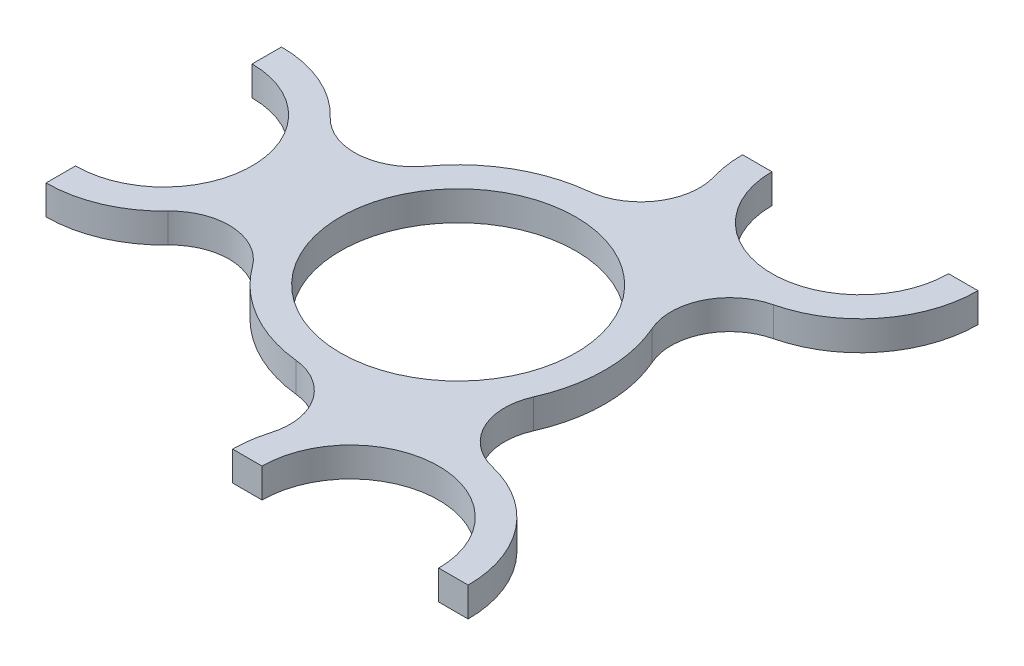
ISO-10303-21;
HEADER;
FILE_DESCRIPTION(('STEP AP214'),'2;1');
FILE_NAME('part.step','',(''),(''),'','','');
FILE_SCHEMA(('AUTOMOTIVE_DESIGN { 1 0 10303 214 1 1 1 1 }'));
ENDSEC;
DATA;
#1=APPLICATION_CONTEXT('core data for automotive mechanical design processes');
#2=APPLICATION_PROTOCOL_DEFINITION('international standard','automotive_design',2000,#1);
#3=PRODUCT_CONTEXT('',#1,'mechanical');
#4=PRODUCT('Part','Part','',(#3));
#5=PRODUCT_RELATED_PRODUCT_CATEGORY('part','',(#4));
#6=PRODUCT_DEFINITION_FORMATION('','',#4);
#7=PRODUCT_DEFINITION_CONTEXT('part definition',#1,'design');
#8=PRODUCT_DEFINITION('design','',#6,#7);
#9=PRODUCT_DEFINITION_SHAPE('','',#8);
#10=(LENGTH_UNIT() NAMED_UNIT(*) SI_UNIT(.MILLI.,.METRE.));
#11=(NAMED_UNIT(*) PLANE_ANGLE_UNIT() SI_UNIT($,.RADIAN.));
#12=(NAMED_UNIT(*) SI_UNIT($,.STERADIAN.) SOLID_ANGLE_UNIT());
#13=UNCERTAINTY_MEASURE_WITH_UNIT(LENGTH_MEASURE(1.E-05),#10,'distance_accuracy_value','');
#14=(GEOMETRIC_REPRESENTATION_CONTEXT(3) GLOBAL_UNCERTAINTY_ASSIGNED_CONTEXT((#13)) GLOBAL_UNIT_ASSIGNED_CONTEXT((#10,
#11,#12)) REPRESENTATION_CONTEXT('',''));
#15=CARTESIAN_POINT('',(0.,0.,0.));
#16=DIRECTION('',(0.,0.,1.));
#17=DIRECTION('',(1.,0.,0.));
#18=AXIS2_PLACEMENT_3D('',#15,#16,#17);
#19=CARTESIAN_POINT('',(50.,10.,86.6));
#20=DIRECTION('',(0.,-1.,0.));
#21=DIRECTION('',(0.,0.,-1.));
#22=AXIS2_PLACEMENT_3D('',#19,#20,#21);
#23=PLANE('',#22);
#24=CARTESIAN_POINT('',(50.,10.,86.6));
#25=DIRECTION('',(0.,-1.,0.));
#26=DIRECTION('',(0.,0.,-1.));
#27=AXIS2_PLACEMENT_3D('',#24,#25,#26);
#28=CIRCLE('',#27,30.);
#29=CARTESIAN_POINT('',(20.,10.,86.6));
#30=VERTEX_POINT('',#29);
#31=CARTESIAN_POINT('',(80.,10.,86.6));
#32=VERTEX_POINT('',#31);
#33=EDGE_CURVE('E277',#30,#32,#28,.T.);
#34=ORIENTED_EDGE('',*,*,#33,.T.);
#35=DIRECTION('',(1.,0.,0.));
#36=VECTOR('',#35,1.);
#37=CARTESIAN_POINT('',(80.,10.,86.6));
#38=LINE('',#37,#36);
#39=CARTESIAN_POINT('',(90.,10.,86.6));
#40=VERTEX_POINT('',#39);
#41=EDGE_CURVE('E145',#32,#40,#38,.T.);
#42=ORIENTED_EDGE('',*,*,#41,.T.);
#43=CARTESIAN_POINT('',(50.,10.,86.6));
#44=DIRECTION('',(0.,1.,0.));
#45=DIRECTION('',(0.,0.,-1.));
#46=AXIS2_PLACEMENT_3D('',#43,#44,#45);
#47=CIRCLE('',#46,40.);
#48=CARTESIAN_POINT('',(59.3596363447783,10.,47.7104486077108));
#49=VERTEX_POINT('',#48);
#50=EDGE_CURVE('E340',#40,#49,#47,.T.);
#51=ORIENTED_EDGE('',*,*,#50,.T.);
#52=CARTESIAN_POINT('',(64.0394545171674,10.,28.2656729115661));
#53=DIRECTION('',(0.,-1.,0.));
#54=DIRECTION('',(0.,0.,1.));
#55=AXIS2_PLACEMENT_3D('',#52,#53,#54);
#56=CIRCLE('',#55,20.);
#57=CARTESIAN_POINT('',(45.7424675122625,10.,20.1897663654044));
#58=VERTEX_POINT('',#57);
#59=EDGE_CURVE('E359',#49,#58,#56,.T.);
#60=ORIENTED_EDGE('',*,*,#59,.T.);
#61=CARTESIAN_POINT('',(0.,10.,0.));
#62=DIRECTION('',(0.,1.,0.));
#63=DIRECTION('',(0.,0.,1.));
#64=AXIS2_PLACEMENT_3D('',#61,#62,#63);
#65=CIRCLE('',#64,50.);
#66=CARTESIAN_POINT('',(45.7424675122625,10.,-20.1897663654044));
#67=VERTEX_POINT('',#66);
#68=EDGE_CURVE('E356',#58,#67,#65,.T.);
#69=ORIENTED_EDGE('',*,*,#68,.T.);
#70=CARTESIAN_POINT('',(64.0394545171674,10.,-28.2656729115661));
#71=DIRECTION('',(0.,-1.,0.));
#72=DIRECTION('',(0.,0.,-1.));
#73=AXIS2_PLACEMENT_3D('',#70,#71,#72);
#74=CIRCLE('',#73,20.);
#75=CARTESIAN_POINT('',(59.3596363447783,10.,-47.7104486077108));
#76=VERTEX_POINT('',#75);
#77=EDGE_CURVE('E358',#67,#76,#74,.T.);
#78=ORIENTED_EDGE('',*,*,#77,.T.);
#79=CARTESIAN_POINT('',(50.,10.,-86.6));
#80=DIRECTION('',(0.,1.,0.));
#81=DIRECTION('',(0.,0.,1.));
#82=AXIS2_PLACEMENT_3D('',#79,#80,#81);
#83=CIRCLE('',#82,40.);
#84=CARTESIAN_POINT('',(90.,10.,-86.6));
#85=VERTEX_POINT('',#84);
#86=EDGE_CURVE('E361',#76,#85,#83,.T.);
#87=ORIENTED_EDGE('',*,*,#86,.T.);
#88=DIRECTION('',(-1.,0.,0.));
#89=VECTOR('',#88,1.);
#90=CARTESIAN_POINT('',(80.,10.,-86.6));
#91=LINE('',#90,#89);
#92=CARTESIAN_POINT('',(80.,10.,-86.6));
#93=VERTEX_POINT('',#92);
#94=EDGE_CURVE('E367',#85,#93,#91,.T.);
#95=ORIENTED_EDGE('',*,*,#94,.T.);
#96=CARTESIAN_POINT('',(50.,10.,-86.6));
#97=DIRECTION('',(0.,-1.,0.));
#98=DIRECTION('',(0.,0.,1.));
#99=AXIS2_PLACEMENT_3D('',#96,#97,#98);
#100=CIRCLE('',#99,30.);
#101=CARTESIAN_POINT('',(20.,10.,-86.6));
#102=VERTEX_POINT('',#101);
#103=EDGE_CURVE('E369',#93,#102,#100,.T.);
#104=ORIENTED_EDGE('',*,*,#103,.T.);
#105=DIRECTION('',(-1.,0.,0.));
#106=VECTOR('',#105,1.);
#107=CARTESIAN_POINT('',(9.99999999999999,10.,-86.6));
#108=LINE('',#107,#106);
#109=CARTESIAN_POINT('',(10.,10.,-86.6));
#110=VERTEX_POINT('',#109);
#111=EDGE_CURVE('E371',#102,#110,#108,.T.);
#112=ORIENTED_EDGE('',*,*,#111,.T.);
#113=CARTESIAN_POINT('',(50.,10.,-86.6));
#114=DIRECTION('',(0.,1.,0.));
#115=DIRECTION('',(0.,0.,1.));
#116=AXIS2_PLACEMENT_3D('',#113,#114,#115);
#117=CIRCLE('',#116,40.);
#118=CARTESIAN_POINT('',(11.6405543302781,10.,-75.2618816414868));
#119=VERTEX_POINT('',#118);
#120=EDGE_CURVE('E373',#110,#119,#117,.T.);
#121=ORIENTED_EDGE('',*,*,#120,.T.);
#122=CARTESIAN_POINT('',(-7.53916850458286,10.,-69.5928224622303));
#123=DIRECTION('',(0.,-1.,0.));
#124=DIRECTION('',(0.,0.,1.));
#125=AXIS2_PLACEMENT_3D('',#122,#123,#124);
#126=CIRCLE('',#125,20.);
#127=CARTESIAN_POINT('',(-5.38512036041633,10.,-49.7091589015931));
#128=VERTEX_POINT('',#127);
#129=EDGE_CURVE('E375',#119,#128,#126,.T.);
#130=ORIENTED_EDGE('',*,*,#129,.T.);
#131=CARTESIAN_POINT('',(0.,10.,0.));
#132=DIRECTION('',(0.,1.,0.));
#133=DIRECTION('',(0.,0.,1.));
#134=AXIS2_PLACEMENT_3D('',#131,#132,#133);
#135=CIRCLE('',#134,50.);
#136=CARTESIAN_POINT('',(-40.3571428571429,10.,-29.5178085299055));
#137=VERTEX_POINT('',#136);
#138=EDGE_CURVE('E377',#128,#137,#135,.T.);
#139=ORIENTED_EDGE('',*,*,#138,.T.);
#140=CARTESIAN_POINT('',(-56.5,10.,-41.3249319418677));
#141=DIRECTION('',(0.,-1.,0.));
#142=DIRECTION('',(0.,0.,1.));
#143=AXIS2_PLACEMENT_3D('',#140,#141,#142);
#144=CIRCLE('',#143,20.);
#145=CARTESIAN_POINT('',(-71.,10.,-27.5499546279118));
#146=VERTEX_POINT('',#145);
#147=EDGE_CURVE('E379',#137,#146,#144,.T.);
#148=ORIENTED_EDGE('',*,*,#147,.T.);
#149=CARTESIAN_POINT('',(-100.,10.,0.));
#150=DIRECTION('',(0.,1.,0.));
#151=DIRECTION('',(0.,0.,1.));
#152=AXIS2_PLACEMENT_3D('',#149,#150,#151);
#153=CIRCLE('',#152,40.);
#154=CARTESIAN_POINT('',(-100.,10.,-40.));
#155=VERTEX_POINT('',#154);
#156=EDGE_CURVE('E381',#146,#155,#153,.T.);
#157=ORIENTED_EDGE('',*,*,#156,.T.);
#158=DIRECTION('',(0.,0.,1.));
#159=VECTOR('',#158,1.);
#160=CARTESIAN_POINT('',(-100.,10.,-30.));
#161=LINE('',#160,#159);
#162=CARTESIAN_POINT('',(-100.,10.,-30.));
#163=VERTEX_POINT('',#162);
#164=EDGE_CURVE('E383',#155,#163,#161,.T.);
#165=ORIENTED_EDGE('',*,*,#164,.T.);
#166=CARTESIAN_POINT('',(-100.,10.,0.));
#167=DIRECTION('',(0.,-1.,0.));
#168=DIRECTION('',(0.,0.,1.));
#169=AXIS2_PLACEMENT_3D('',#166,#167,#168);
#170=CIRCLE('',#169,30.);
#171=CARTESIAN_POINT('',(-100.,10.,30.));
#172=VERTEX_POINT('',#171);
#173=EDGE_CURVE('E385',#163,#172,#170,.T.);
#174=ORIENTED_EDGE('',*,*,#173,.T.);
#175=DIRECTION('',(0.,0.,1.));
#176=VECTOR('',#175,1.);
#177=CARTESIAN_POINT('',(-100.,10.,30.));
#178=LINE('',#177,#176);
#179=CARTESIAN_POINT('',(-100.,10.,40.));
#180=VERTEX_POINT('',#179);
#181=EDGE_CURVE('E387',#172,#180,#178,.T.);
#182=ORIENTED_EDGE('',*,*,#181,.T.);
#183=CARTESIAN_POINT('',(-100.,10.,0.));
#184=DIRECTION('',(0.,1.,0.));
#185=DIRECTION('',(0.,0.,1.));
#186=AXIS2_PLACEMENT_3D('',#183,#184,#185);
#187=CIRCLE('',#186,40.);
#188=CARTESIAN_POINT('',(-71.,10.,27.5499546279118));
#189=VERTEX_POINT('',#188);
#190=EDGE_CURVE('E389',#180,#189,#187,.T.);
#191=ORIENTED_EDGE('',*,*,#190,.T.);
#192=CARTESIAN_POINT('',(-56.5,10.,41.3249319418677));
#193=DIRECTION('',(0.,-1.,0.));
#194=DIRECTION('',(0.,0.,1.));
#195=AXIS2_PLACEMENT_3D('',#192,#193,#194);
#196=CIRCLE('',#195,20.);
#197=CARTESIAN_POINT('',(-40.3571428571428,10.,29.5178085299055));
#198=VERTEX_POINT('',#197);
#199=EDGE_CURVE('E391',#189,#198,#196,.T.);
#200=ORIENTED_EDGE('',*,*,#199,.T.);
#201=CARTESIAN_POINT('',(0.,10.,0.));
#202=DIRECTION('',(0.,1.,0.));
#203=DIRECTION('',(0.,0.,1.));
#204=AXIS2_PLACEMENT_3D('',#201,#202,#203);
#205=CIRCLE('',#204,50.);
#206=CARTESIAN_POINT('',(-5.38512036041633,10.,49.7091589015931));
#207=VERTEX_POINT('',#206);
#208=EDGE_CURVE('E212',#198,#207,#205,.T.);
#209=ORIENTED_EDGE('',*,*,#208,.T.);
#210=CARTESIAN_POINT('',(-7.53916850458286,10.,69.5928224622303));
#211=DIRECTION('',(0.,-1.,0.));
#212=DIRECTION('',(0.,0.,-1.));
#213=AXIS2_PLACEMENT_3D('',#210,#211,#212);
#214=CIRCLE('',#213,20.);
#215=CARTESIAN_POINT('',(11.6405543302781,10.,75.2618816414869));
#216=VERTEX_POINT('',#215);
#217=EDGE_CURVE('E206',#207,#216,#214,.T.);
#218=ORIENTED_EDGE('',*,*,#217,.T.);
#219=CARTESIAN_POINT('',(50.,10.,86.6));
#220=DIRECTION('',(0.,1.,0.));
#221=DIRECTION('',(0.,0.,-1.));
#222=AXIS2_PLACEMENT_3D('',#219,#220,#221);
#223=CIRCLE('',#222,40.);
#224=CARTESIAN_POINT('',(9.99999999999999,10.,86.6));
#225=VERTEX_POINT('',#224);
#226=EDGE_CURVE('E210',#216,#225,#223,.T.);
#227=ORIENTED_EDGE('',*,*,#226,.T.);
#228=DIRECTION('',(1.,0.,0.));
#229=VECTOR('',#228,1.);
#230=CARTESIAN_POINT('',(9.99999999999999,10.,86.6));
#231=LINE('',#230,#229);
#232=EDGE_CURVE('E54',#225,#30,#231,.T.);
#233=ORIENTED_EDGE('',*,*,#232,.T.);
#234=EDGE_LOOP('',(#34,#42,#51,#60,#69,#78,#87,#95,#104,#112,#121,#130,#139,#148,#157,#165,#174,
#182,#191,#200,#209,#218,#227,#233));
#235=FACE_BOUND('',#234,.T.);
#236=CARTESIAN_POINT('',(0.,10.,0.));
#237=DIRECTION('',(0.,1.,0.));
#238=DIRECTION('',(0.,0.,1.));
#239=AXIS2_PLACEMENT_3D('',#236,#237,#238);
#240=CIRCLE('',#239,40.);
#241=CARTESIAN_POINT('',(0.,10.,40.));
#242=VERTEX_POINT('',#241);
#243=EDGE_CURVE('E234',#242,#242,#240,.T.);
#244=ORIENTED_EDGE('',*,*,#243,.F.);
#245=EDGE_LOOP('',(#244));
#246=FACE_BOUND('',#245,.T.);
#247=ADVANCED_FACE('F37',(#235,#246),#23,.F.);
#248=CARTESIAN_POINT('',(50.,0.,86.6));
#249=DIRECTION('',(0.,-1.,0.));
#250=DIRECTION('',(0.,0.,-1.));
#251=AXIS2_PLACEMENT_3D('',#248,#249,#250);
#252=PLANE('',#251);
#253=CARTESIAN_POINT('',(50.,0.,86.6));
#254=DIRECTION('',(0.,-1.,0.));
#255=DIRECTION('',(0.,0.,-1.));
#256=AXIS2_PLACEMENT_3D('',#253,#254,#255);
#257=CIRCLE('',#256,30.);
#258=CARTESIAN_POINT('',(20.,0.,86.6));
#259=VERTEX_POINT('',#258);
#260=CARTESIAN_POINT('',(80.,0.,86.6));
#261=VERTEX_POINT('',#260);
#262=EDGE_CURVE('E230',#259,#261,#257,.T.);
#263=ORIENTED_EDGE('',*,*,#262,.F.);
#264=DIRECTION('',(1.,0.,0.));
#265=VECTOR('',#264,1.);
#266=CARTESIAN_POINT('',(9.99999999999999,0.,86.6));
#267=LINE('',#266,#265);
#268=CARTESIAN_POINT('',(9.99999999999999,0.,86.6));
#269=VERTEX_POINT('',#268);
#270=EDGE_CURVE('E137',#269,#259,#267,.T.);
#271=ORIENTED_EDGE('',*,*,#270,.F.);
#272=CARTESIAN_POINT('',(50.,0.,86.6));
#273=DIRECTION('',(0.,1.,0.));
#274=DIRECTION('',(0.,0.,-1.));
#275=AXIS2_PLACEMENT_3D('',#272,#273,#274);
#276=CIRCLE('',#275,40.);
#277=CARTESIAN_POINT('',(11.6405543302781,0.,75.2618816414869));
#278=VERTEX_POINT('',#277);
#279=EDGE_CURVE('E131',#278,#269,#276,.T.);
#280=ORIENTED_EDGE('',*,*,#279,.F.);
#281=CARTESIAN_POINT('',(-7.53916850458286,0.,69.5928224622303));
#282=DIRECTION('',(0.,-1.,0.));
#283=DIRECTION('',(0.,0.,-1.));
#284=AXIS2_PLACEMENT_3D('',#281,#282,#283);
#285=CIRCLE('',#284,20.);
#286=CARTESIAN_POINT('',(-5.38512036041633,0.,49.7091589015931));
#287=VERTEX_POINT('',#286);
#288=EDGE_CURVE('E220',#287,#278,#285,.T.);
#289=ORIENTED_EDGE('',*,*,#288,.F.);
#290=CARTESIAN_POINT('',(0.,0.,0.));
#291=DIRECTION('',(0.,1.,0.));
#292=DIRECTION('',(0.,0.,1.));
#293=AXIS2_PLACEMENT_3D('',#290,#291,#292);
#294=CIRCLE('',#293,50.);
#295=CARTESIAN_POINT('',(-40.3571428571428,0.,29.5178085299055));
#296=VERTEX_POINT('',#295);
#297=EDGE_CURVE('E272',#296,#287,#294,.T.);
#298=ORIENTED_EDGE('',*,*,#297,.F.);
#299=CARTESIAN_POINT('',(-56.5,0.,41.3249319418677));
#300=DIRECTION('',(0.,-1.,0.));
#301=DIRECTION('',(0.,0.,1.));
#302=AXIS2_PLACEMENT_3D('',#299,#300,#301);
#303=CIRCLE('',#302,20.);
#304=CARTESIAN_POINT('',(-71.,0.,27.5499546279118));
#305=VERTEX_POINT('',#304);
#306=EDGE_CURVE('E270',#305,#296,#303,.T.);
#307=ORIENTED_EDGE('',*,*,#306,.F.);
#308=CARTESIAN_POINT('',(-100.,0.,0.));
#309=DIRECTION('',(0.,1.,0.));
#310=DIRECTION('',(0.,0.,1.));
#311=AXIS2_PLACEMENT_3D('',#308,#309,#310);
#312=CIRCLE('',#311,40.);
#313=CARTESIAN_POINT('',(-100.,0.,40.));
#314=VERTEX_POINT('',#313);
#315=EDGE_CURVE('E268',#314,#305,#312,.T.);
#316=ORIENTED_EDGE('',*,*,#315,.F.);
#317=DIRECTION('',(0.,0.,1.));
#318=VECTOR('',#317,1.);
#319=CARTESIAN_POINT('',(-100.,0.,30.));
#320=LINE('',#319,#318);
#321=CARTESIAN_POINT('',(-100.,0.,30.));
#322=VERTEX_POINT('',#321);
#323=EDGE_CURVE('E266',#322,#314,#320,.T.);
#324=ORIENTED_EDGE('',*,*,#323,.F.);
#325=CARTESIAN_POINT('',(-100.,0.,0.));
#326=DIRECTION('',(0.,-1.,0.));
#327=DIRECTION('',(0.,0.,1.));
#328=AXIS2_PLACEMENT_3D('',#325,#326,#327);
#329=CIRCLE('',#328,30.);
#330=CARTESIAN_POINT('',(-100.,0.,-30.));
#331=VERTEX_POINT('',#330);
#332=EDGE_CURVE('E264',#331,#322,#329,.T.);
#333=ORIENTED_EDGE('',*,*,#332,.F.);
#334=DIRECTION('',(0.,0.,1.));
#335=VECTOR('',#334,1.);
#336=CARTESIAN_POINT('',(-100.,0.,-30.));
#337=LINE('',#336,#335);
#338=CARTESIAN_POINT('',(-100.,0.,-40.));
#339=VERTEX_POINT('',#338);
#340=EDGE_CURVE('E262',#339,#331,#337,.T.);
#341=ORIENTED_EDGE('',*,*,#340,.F.);
#342=CARTESIAN_POINT('',(-100.,0.,0.));
#343=DIRECTION('',(0.,1.,0.));
#344=DIRECTION('',(0.,0.,1.));
#345=AXIS2_PLACEMENT_3D('',#342,#343,#344);
#346=CIRCLE('',#345,40.);
#347=CARTESIAN_POINT('',(-71.,0.,-27.5499546279118));
#348=VERTEX_POINT('',#347);
#349=EDGE_CURVE('E260',#348,#339,#346,.T.);
#350=ORIENTED_EDGE('',*,*,#349,.F.);
#351=CARTESIAN_POINT('',(-56.5,0.,-41.3249319418677));
#352=DIRECTION('',(0.,-1.,0.));
#353=DIRECTION('',(0.,0.,1.));
#354=AXIS2_PLACEMENT_3D('',#351,#352,#353);
#355=CIRCLE('',#354,20.);
#356=CARTESIAN_POINT('',(-40.3571428571429,0.,-29.5178085299055));
#357=VERTEX_POINT('',#356);
#358=EDGE_CURVE('E258',#357,#348,#355,.T.);
#359=ORIENTED_EDGE('',*,*,#358,.F.);
#360=CARTESIAN_POINT('',(0.,0.,0.));
#361=DIRECTION('',(0.,1.,0.));
#362=DIRECTION('',(0.,0.,1.));
#363=AXIS2_PLACEMENT_3D('',#360,#361,#362);
#364=CIRCLE('',#363,50.);
#365=CARTESIAN_POINT('',(-5.38512036041633,0.,-49.7091589015931));
#366=VERTEX_POINT('',#365);
#367=EDGE_CURVE('E256',#366,#357,#364,.T.);
#368=ORIENTED_EDGE('',*,*,#367,.F.);
#369=CARTESIAN_POINT('',(-7.53916850458286,0.,-69.5928224622303));
#370=DIRECTION('',(0.,-1.,0.));
#371=DIRECTION('',(0.,0.,1.));
#372=AXIS2_PLACEMENT_3D('',#369,#370,#371);
#373=CIRCLE('',#372,20.);
#374=CARTESIAN_POINT('',(11.6405543302781,0.,-75.2618816414868));
#375=VERTEX_POINT('',#374);
#376=EDGE_CURVE('E254',#375,#366,#373,.T.);
#377=ORIENTED_EDGE('',*,*,#376,.F.);
#378=CARTESIAN_POINT('',(50.,0.,-86.6));
#379=DIRECTION('',(0.,1.,0.));
#380=DIRECTION('',(0.,0.,1.));
#381=AXIS2_PLACEMENT_3D('',#378,#379,#380);
#382=CIRCLE('',#381,40.);
#383=CARTESIAN_POINT('',(10.,0.,-86.6));
#384=VERTEX_POINT('',#383);
#385=EDGE_CURVE('E252',#384,#375,#382,.T.);
#386=ORIENTED_EDGE('',*,*,#385,.F.);
#387=DIRECTION('',(-1.,0.,0.));
#388=VECTOR('',#387,1.);
#389=CARTESIAN_POINT('',(9.99999999999999,0.,-86.6));
#390=LINE('',#389,#388);
#391=CARTESIAN_POINT('',(20.,0.,-86.6));
#392=VERTEX_POINT('',#391);
#393=EDGE_CURVE('E250',#392,#384,#390,.T.);
#394=ORIENTED_EDGE('',*,*,#393,.F.);
#395=CARTESIAN_POINT('',(50.,0.,-86.6));
#396=DIRECTION('',(0.,-1.,0.));
#397=DIRECTION('',(0.,0.,1.));
#398=AXIS2_PLACEMENT_3D('',#395,#396,#397);
#399=CIRCLE('',#398,30.);
#400=CARTESIAN_POINT('',(80.,0.,-86.6));
#401=VERTEX_POINT('',#400);
#402=EDGE_CURVE('E248',#401,#392,#399,.T.);
#403=ORIENTED_EDGE('',*,*,#402,.F.);
#404=DIRECTION('',(-1.,0.,0.));
#405=VECTOR('',#404,1.);
#406=CARTESIAN_POINT('',(80.,0.,-86.6));
#407=LINE('',#406,#405);
#408=CARTESIAN_POINT('',(90.,0.,-86.6));
#409=VERTEX_POINT('',#408);
#410=EDGE_CURVE('E246',#409,#401,#407,.T.);
#411=ORIENTED_EDGE('',*,*,#410,.F.);
#412=CARTESIAN_POINT('',(50.,0.,-86.6));
#413=DIRECTION('',(0.,1.,0.));
#414=DIRECTION('',(0.,0.,1.));
#415=AXIS2_PLACEMENT_3D('',#412,#413,#414);
#416=CIRCLE('',#415,40.);
#417=CARTESIAN_POINT('',(59.3596363447783,0.,-47.7104486077108));
#418=VERTEX_POINT('',#417);
#419=EDGE_CURVE('E244',#418,#409,#416,.T.);
#420=ORIENTED_EDGE('',*,*,#419,.F.);
#421=CARTESIAN_POINT('',(64.0394545171674,0.,-28.2656729115661));
#422=DIRECTION('',(0.,-1.,0.));
#423=DIRECTION('',(0.,0.,-1.));
#424=AXIS2_PLACEMENT_3D('',#421,#422,#423);
#425=CIRCLE('',#424,20.);
#426=CARTESIAN_POINT('',(45.7424675122625,0.,-20.1897663654044));
#427=VERTEX_POINT('',#426);
#428=EDGE_CURVE('E242',#427,#418,#425,.T.);
#429=ORIENTED_EDGE('',*,*,#428,.F.);
#430=CARTESIAN_POINT('',(0.,0.,0.));
#431=DIRECTION('',(0.,1.,0.));
#432=DIRECTION('',(0.,0.,1.));
#433=AXIS2_PLACEMENT_3D('',#430,#431,#432);
#434=CIRCLE('',#433,50.);
#435=CARTESIAN_POINT('',(45.7424675122625,0.,20.1897663654044));
#436=VERTEX_POINT('',#435);
#437=EDGE_CURVE('E240',#436,#427,#434,.T.);
#438=ORIENTED_EDGE('',*,*,#437,.F.);
#439=CARTESIAN_POINT('',(64.0394545171674,0.,28.2656729115661));
#440=DIRECTION('',(0.,-1.,0.));
#441=DIRECTION('',(0.,0.,1.));
#442=AXIS2_PLACEMENT_3D('',#439,#440,#441);
#443=CIRCLE('',#442,20.);
#444=CARTESIAN_POINT('',(59.3596363447783,0.,47.7104486077108));
#445=VERTEX_POINT('',#444);
#446=EDGE_CURVE('E238',#445,#436,#443,.T.);
#447=ORIENTED_EDGE('',*,*,#446,.F.);
#448=CARTESIAN_POINT('',(50.,0.,86.6));
#449=DIRECTION('',(0.,1.,0.));
#450=DIRECTION('',(0.,0.,-1.));
#451=AXIS2_PLACEMENT_3D('',#448,#449,#450);
#452=CIRCLE('',#451,40.);
#453=CARTESIAN_POINT('',(90.,0.,86.6));
#454=VERTEX_POINT('',#453);
#455=EDGE_CURVE('E236',#454,#445,#452,.T.);
#456=ORIENTED_EDGE('',*,*,#455,.F.);
#457=DIRECTION('',(1.,0.,0.));
#458=VECTOR('',#457,1.);
#459=CARTESIAN_POINT('',(80.,0.,86.6));
#460=LINE('',#459,#458);
#461=EDGE_CURVE('E233',#261,#454,#460,.T.);
#462=ORIENTED_EDGE('',*,*,#461,.F.);
#463=EDGE_LOOP('',(#263,#271,#280,#289,#298,#307,#316,#324,#333,#341,#350,#359,#368,#377,#386,
#394,#403,#411,#420,#429,#438,#447,#456,#462));
#464=FACE_BOUND('',#463,.T.);
#465=CARTESIAN_POINT('',(0.,0.,0.));
#466=DIRECTION('',(0.,1.,0.));
#467=DIRECTION('',(0.,0.,1.));
#468=AXIS2_PLACEMENT_3D('',#465,#466,#467);
#469=CIRCLE('',#468,40.);
#470=CARTESIAN_POINT('',(0.,0.,40.));
#471=VERTEX_POINT('',#470);
#472=EDGE_CURVE('E748',#471,#471,#469,.T.);
#473=ORIENTED_EDGE('',*,*,#472,.T.);
#474=EDGE_LOOP('',(#473));
#475=FACE_BOUND('',#474,.T.);
#476=ADVANCED_FACE('F344',(#464,#475),#252,.T.);
#477=CARTESIAN_POINT('',(50.,10.,86.6));
#478=DIRECTION('',(0.,-1.,0.));
#479=DIRECTION('',(0.,0.,-1.));
#480=AXIS2_PLACEMENT_3D('',#477,#478,#479);
#481=CYLINDRICAL_SURFACE('',#480,30.);
#482=ORIENTED_EDGE('',*,*,#262,.T.);
#483=DIRECTION('',(0.,-1.,0.));
#484=VECTOR('',#483,1.);
#485=CARTESIAN_POINT('',(80.,10.,86.6));
#486=LINE('',#485,#484);
#487=EDGE_CURVE('E11',#32,#261,#486,.T.);
#488=ORIENTED_EDGE('',*,*,#487,.F.);
#489=ORIENTED_EDGE('',*,*,#33,.F.);
#490=DIRECTION('',(0.,-1.,0.));
#491=VECTOR('',#490,1.);
#492=CARTESIAN_POINT('',(20.,10.,86.6));
#493=LINE('',#492,#491);
#494=EDGE_CURVE('E226',#30,#259,#493,.T.);
#495=ORIENTED_EDGE('',*,*,#494,.T.);
#496=EDGE_LOOP('',(#482,#488,#489,#495));
#497=FACE_BOUND('',#496,.T.);
#498=ADVANCED_FACE('F39',(#497),#481,.F.);
#499=CARTESIAN_POINT('',(80.,10.,86.6));
#500=DIRECTION('',(0.,0.,-1.));
#501=DIRECTION('',(-1.,0.,0.));
#502=AXIS2_PLACEMENT_3D('',#499,#500,#501);
#503=PLANE('',#502);
#504=ORIENTED_EDGE('',*,*,#461,.T.);
#505=DIRECTION('',(0.,-1.,0.));
#506=VECTOR('',#505,1.);
#507=CARTESIAN_POINT('',(90.,10.,86.6));
#508=LINE('',#507,#506);
#509=EDGE_CURVE('E46',#40,#454,#508,.T.);
#510=ORIENTED_EDGE('',*,*,#509,.F.);
#511=ORIENTED_EDGE('',*,*,#41,.F.);
#512=ORIENTED_EDGE('',*,*,#487,.T.);
#513=EDGE_LOOP('',(#504,#510,#511,#512));
#514=FACE_BOUND('',#513,.T.);
#515=ADVANCED_FACE('F425',(#514),#503,.F.);
#516=CARTESIAN_POINT('',(50.,10.,86.6));
#517=DIRECTION('',(0.,-1.,0.));
#518=DIRECTION('',(0.,0.,-1.));
#519=AXIS2_PLACEMENT_3D('',#516,#517,#518);
#520=CYLINDRICAL_SURFACE('',#519,40.);
#521=ORIENTED_EDGE('',*,*,#455,.T.);
#522=DIRECTION('',(0.,-1.,0.));
#523=VECTOR('',#522,1.);
#524=CARTESIAN_POINT('',(59.3596363447783,10.,47.7104486077108));
#525=LINE('',#524,#523);
#526=EDGE_CURVE('E332',#49,#445,#525,.T.);
#527=ORIENTED_EDGE('',*,*,#526,.F.);
#528=ORIENTED_EDGE('',*,*,#50,.F.);
#529=ORIENTED_EDGE('',*,*,#509,.T.);
#530=EDGE_LOOP('',(#521,#527,#528,#529));
#531=FACE_BOUND('',#530,.T.);
#532=ADVANCED_FACE('F338',(#531),#520,.T.);
#533=CARTESIAN_POINT('',(64.0394545171674,10.,28.2656729115661));
#534=DIRECTION('',(0.,-1.,0.));
#535=DIRECTION('',(0.,0.,-1.));
#536=AXIS2_PLACEMENT_3D('',#533,#534,#535);
#537=CYLINDRICAL_SURFACE('',#536,20.);
#538=ORIENTED_EDGE('',*,*,#446,.T.);
#539=DIRECTION('',(0.,-1.,0.));
#540=VECTOR('',#539,1.);
#541=CARTESIAN_POINT('',(45.7424675122625,10.,20.1897663654044));
#542=LINE('',#541,#540);
#543=EDGE_CURVE('E329',#58,#436,#542,.T.);
#544=ORIENTED_EDGE('',*,*,#543,.F.);
#545=ORIENTED_EDGE('',*,*,#59,.F.);
#546=ORIENTED_EDGE('',*,*,#526,.T.);
#547=EDGE_LOOP('',(#538,#544,#545,#546));
#548=FACE_BOUND('',#547,.T.);
#549=ADVANCED_FACE('F350',(#548),#537,.F.);
#550=CARTESIAN_POINT('',(0.,10.,0.));
#551=DIRECTION('',(0.,-1.,0.));
#552=DIRECTION('',(0.,0.,-1.));
#553=AXIS2_PLACEMENT_3D('',#550,#551,#552);
#554=CYLINDRICAL_SURFACE('',#553,50.);
#555=ORIENTED_EDGE('',*,*,#437,.T.);
#556=DIRECTION('',(0.,-1.,0.));
#557=VECTOR('',#556,1.);
#558=CARTESIAN_POINT('',(45.7424675122625,10.,-20.1897663654044));
#559=LINE('',#558,#557);
#560=EDGE_CURVE('E326',#67,#427,#559,.T.);
#561=ORIENTED_EDGE('',*,*,#560,.F.);
#562=ORIENTED_EDGE('',*,*,#68,.F.);
#563=ORIENTED_EDGE('',*,*,#543,.T.);
#564=EDGE_LOOP('',(#555,#561,#562,#563));
#565=FACE_BOUND('',#564,.T.);
#566=ADVANCED_FACE('F354',(#565),#554,.T.);
#567=CARTESIAN_POINT('',(64.0394545171674,10.,-28.2656729115661));
#568=DIRECTION('',(0.,-1.,0.));
#569=DIRECTION('',(0.,0.,-1.));
#570=AXIS2_PLACEMENT_3D('',#567,#568,#569);
#571=CYLINDRICAL_SURFACE('',#570,20.);
#572=ORIENTED_EDGE('',*,*,#428,.T.);
#573=DIRECTION('',(0.,-1.,0.));
#574=VECTOR('',#573,1.);
#575=CARTESIAN_POINT('',(59.3596363447783,10.,-47.7104486077108));
#576=LINE('',#575,#574);
#577=EDGE_CURVE('E323',#76,#418,#576,.T.);
#578=ORIENTED_EDGE('',*,*,#577,.F.);
#579=ORIENTED_EDGE('',*,*,#77,.F.);
#580=ORIENTED_EDGE('',*,*,#560,.T.);
#581=EDGE_LOOP('',(#572,#578,#579,#580));
#582=FACE_BOUND('',#581,.T.);
#583=ADVANCED_FACE('F438',(#582),#571,.F.);
#584=CARTESIAN_POINT('',(50.,10.,-86.6));
#585=DIRECTION('',(0.,-1.,0.));
#586=DIRECTION('',(0.,0.,-1.));
#587=AXIS2_PLACEMENT_3D('',#584,#585,#586);
#588=CYLINDRICAL_SURFACE('',#587,40.);
#589=ORIENTED_EDGE('',*,*,#419,.T.);
#590=DIRECTION('',(0.,-1.,0.));
#591=VECTOR('',#590,1.);
#592=CARTESIAN_POINT('',(90.,10.,-86.6));
#593=LINE('',#592,#591);
#594=EDGE_CURVE('E320',#85,#409,#593,.T.);
#595=ORIENTED_EDGE('',*,*,#594,.F.);
#596=ORIENTED_EDGE('',*,*,#86,.F.);
#597=ORIENTED_EDGE('',*,*,#577,.T.);
#598=EDGE_LOOP('',(#589,#595,#596,#597));
#599=FACE_BOUND('',#598,.T.);
#600=ADVANCED_FACE('F441',(#599),#588,.T.);
#601=CARTESIAN_POINT('',(80.,10.,-86.6));
#602=DIRECTION('',(0.,0.,1.));
#603=DIRECTION('',(1.,0.,0.));
#604=AXIS2_PLACEMENT_3D('',#601,#602,#603);
#605=PLANE('',#604);
#606=ORIENTED_EDGE('',*,*,#410,.T.);
#607=DIRECTION('',(0.,-1.,0.));
#608=VECTOR('',#607,1.);
#609=CARTESIAN_POINT('',(80.,10.,-86.6));
#610=LINE('',#609,#608);
#611=EDGE_CURVE('E317',#93,#401,#610,.T.);
#612=ORIENTED_EDGE('',*,*,#611,.F.);
#613=ORIENTED_EDGE('',*,*,#94,.F.);
#614=ORIENTED_EDGE('',*,*,#594,.T.);
#615=EDGE_LOOP('',(#606,#612,#613,#614));
#616=FACE_BOUND('',#615,.T.);
#617=ADVANCED_FACE('F445',(#616),#605,.F.);
#618=CARTESIAN_POINT('',(50.,10.,-86.6));
#619=DIRECTION('',(0.,-1.,0.));
#620=DIRECTION('',(0.,0.,-1.));
#621=AXIS2_PLACEMENT_3D('',#618,#619,#620);
#622=CYLINDRICAL_SURFACE('',#621,30.);
#623=ORIENTED_EDGE('',*,*,#402,.T.);
#624=DIRECTION('',(0.,-1.,0.));
#625=VECTOR('',#624,1.);
#626=CARTESIAN_POINT('',(20.,10.,-86.6));
#627=LINE('',#626,#625);
#628=EDGE_CURVE('E314',#102,#392,#627,.T.);
#629=ORIENTED_EDGE('',*,*,#628,.F.);
#630=ORIENTED_EDGE('',*,*,#103,.F.);
#631=ORIENTED_EDGE('',*,*,#611,.T.);
#632=EDGE_LOOP('',(#623,#629,#630,#631));
#633=FACE_BOUND('',#632,.T.);
#634=ADVANCED_FACE('F449',(#633),#622,.F.);
#635=CARTESIAN_POINT('',(9.99999999999999,10.,-86.6));
#636=DIRECTION('',(0.,0.,1.));
#637=DIRECTION('',(1.,0.,0.));
#638=AXIS2_PLACEMENT_3D('',#635,#636,#637);
#639=PLANE('',#638);
#640=ORIENTED_EDGE('',*,*,#393,.T.);
#641=DIRECTION('',(0.,-1.,0.));
#642=VECTOR('',#641,1.);
#643=CARTESIAN_POINT('',(10.,10.,-86.6));
#644=LINE('',#643,#642);
#645=EDGE_CURVE('E311',#110,#384,#644,.T.);
#646=ORIENTED_EDGE('',*,*,#645,.F.);
#647=ORIENTED_EDGE('',*,*,#111,.F.);
#648=ORIENTED_EDGE('',*,*,#628,.T.);
#649=EDGE_LOOP('',(#640,#646,#647,#648));
#650=FACE_BOUND('',#649,.T.);
#651=ADVANCED_FACE('F453',(#650),#639,.F.);
#652=CARTESIAN_POINT('',(50.,10.,-86.6));
#653=DIRECTION('',(0.,-1.,0.));
#654=DIRECTION('',(0.,0.,-1.));
#655=AXIS2_PLACEMENT_3D('',#652,#653,#654);
#656=CYLINDRICAL_SURFACE('',#655,40.);
#657=ORIENTED_EDGE('',*,*,#385,.T.);
#658=DIRECTION('',(0.,-1.,0.));
#659=VECTOR('',#658,1.);
#660=CARTESIAN_POINT('',(11.6405543302781,10.,-75.2618816414868));
#661=LINE('',#660,#659);
#662=EDGE_CURVE('E308',#119,#375,#661,.T.);
#663=ORIENTED_EDGE('',*,*,#662,.F.);
#664=ORIENTED_EDGE('',*,*,#120,.F.);
#665=ORIENTED_EDGE('',*,*,#645,.T.);
#666=EDGE_LOOP('',(#657,#663,#664,#665));
#667=FACE_BOUND('',#666,.T.);
#668=ADVANCED_FACE('F457',(#667),#656,.T.);
#669=CARTESIAN_POINT('',(-7.53916850458286,10.,-69.5928224622303));
#670=DIRECTION('',(0.,-1.,0.));
#671=DIRECTION('',(0.,0.,-1.));
#672=AXIS2_PLACEMENT_3D('',#669,#670,#671);
#673=CYLINDRICAL_SURFACE('',#672,20.);
#674=ORIENTED_EDGE('',*,*,#376,.T.);
#675=DIRECTION('',(0.,-1.,0.));
#676=VECTOR('',#675,1.);
#677=CARTESIAN_POINT('',(-5.38512036041633,10.,-49.7091589015931));
#678=LINE('',#677,#676);
#679=EDGE_CURVE('E305',#128,#366,#678,.T.);
#680=ORIENTED_EDGE('',*,*,#679,.F.);
#681=ORIENTED_EDGE('',*,*,#129,.F.);
#682=ORIENTED_EDGE('',*,*,#662,.T.);
#683=EDGE_LOOP('',(#674,#680,#681,#682));
#684=FACE_BOUND('',#683,.T.);
#685=ADVANCED_FACE('F461',(#684),#673,.F.);
#686=CARTESIAN_POINT('',(0.,10.,0.));
#687=DIRECTION('',(0.,-1.,0.));
#688=DIRECTION('',(0.,0.,-1.));
#689=AXIS2_PLACEMENT_3D('',#686,#687,#688);
#690=CYLINDRICAL_SURFACE('',#689,50.);
#691=ORIENTED_EDGE('',*,*,#367,.T.);
#692=DIRECTION('',(0.,-1.,0.));
#693=VECTOR('',#692,1.);
#694=CARTESIAN_POINT('',(-40.3571428571429,10.,-29.5178085299055));
#695=LINE('',#694,#693);
#696=EDGE_CURVE('E302',#137,#357,#695,.T.);
#697=ORIENTED_EDGE('',*,*,#696,.F.);
#698=ORIENTED_EDGE('',*,*,#138,.F.);
#699=ORIENTED_EDGE('',*,*,#679,.T.);
#700=EDGE_LOOP('',(#691,#697,#698,#699));
#701=FACE_BOUND('',#700,.T.);
#702=ADVANCED_FACE('F465',(#701),#690,.T.);
#703=CARTESIAN_POINT('',(-56.5,10.,-41.3249319418677));
#704=DIRECTION('',(0.,-1.,0.));
#705=DIRECTION('',(0.,0.,-1.));
#706=AXIS2_PLACEMENT_3D('',#703,#704,#705);
#707=CYLINDRICAL_SURFACE('',#706,20.);
#708=ORIENTED_EDGE('',*,*,#358,.T.);
#709=DIRECTION('',(0.,-1.,0.));
#710=VECTOR('',#709,1.);
#711=CARTESIAN_POINT('',(-71.,10.,-27.5499546279118));
#712=LINE('',#711,#710);
#713=EDGE_CURVE('E299',#146,#348,#712,.T.);
#714=ORIENTED_EDGE('',*,*,#713,.F.);
#715=ORIENTED_EDGE('',*,*,#147,.F.);
#716=ORIENTED_EDGE('',*,*,#696,.T.);
#717=EDGE_LOOP('',(#708,#714,#715,#716));
#718=FACE_BOUND('',#717,.T.);
#719=ADVANCED_FACE('F469',(#718),#707,.F.);
#720=CARTESIAN_POINT('',(-100.,10.,0.));
#721=DIRECTION('',(0.,-1.,0.));
#722=DIRECTION('',(0.,0.,-1.));
#723=AXIS2_PLACEMENT_3D('',#720,#721,#722);
#724=CYLINDRICAL_SURFACE('',#723,40.);
#725=ORIENTED_EDGE('',*,*,#349,.T.);
#726=DIRECTION('',(0.,-1.,0.));
#727=VECTOR('',#726,1.);
#728=CARTESIAN_POINT('',(-100.,10.,-40.));
#729=LINE('',#728,#727);
#730=EDGE_CURVE('E296',#155,#339,#729,.T.);
#731=ORIENTED_EDGE('',*,*,#730,.F.);
#732=ORIENTED_EDGE('',*,*,#156,.F.);
#733=ORIENTED_EDGE('',*,*,#713,.T.);
#734=EDGE_LOOP('',(#725,#731,#732,#733));
#735=FACE_BOUND('',#734,.T.);
#736=ADVANCED_FACE('F473',(#735),#724,.T.);
#737=CARTESIAN_POINT('',(-100.,10.,-30.));
#738=DIRECTION('',(1.,0.,0.));
#739=DIRECTION('',(0.,0.,-1.));
#740=AXIS2_PLACEMENT_3D('',#737,#738,#739);
#741=PLANE('',#740);
#742=ORIENTED_EDGE('',*,*,#340,.T.);
#743=DIRECTION('',(0.,-1.,0.));
#744=VECTOR('',#743,1.);
#745=CARTESIAN_POINT('',(-100.,10.,-30.));
#746=LINE('',#745,#744);
#747=EDGE_CURVE('E293',#163,#331,#746,.T.);
#748=ORIENTED_EDGE('',*,*,#747,.F.);
#749=ORIENTED_EDGE('',*,*,#164,.F.);
#750=ORIENTED_EDGE('',*,*,#730,.T.);
#751=EDGE_LOOP('',(#742,#748,#749,#750));
#752=FACE_BOUND('',#751,.T.);
#753=ADVANCED_FACE('F477',(#752),#741,.F.);
#754=CARTESIAN_POINT('',(-100.,10.,0.));
#755=DIRECTION('',(0.,-1.,0.));
#756=DIRECTION('',(0.,0.,-1.));
#757=AXIS2_PLACEMENT_3D('',#754,#755,#756);
#758=CYLINDRICAL_SURFACE('',#757,30.);
#759=ORIENTED_EDGE('',*,*,#332,.T.);
#760=DIRECTION('',(0.,-1.,0.));
#761=VECTOR('',#760,1.);
#762=CARTESIAN_POINT('',(-100.,10.,30.));
#763=LINE('',#762,#761);
#764=EDGE_CURVE('E290',#172,#322,#763,.T.);
#765=ORIENTED_EDGE('',*,*,#764,.F.);
#766=ORIENTED_EDGE('',*,*,#173,.F.);
#767=ORIENTED_EDGE('',*,*,#747,.T.);
#768=EDGE_LOOP('',(#759,#765,#766,#767));
#769=FACE_BOUND('',#768,.T.);
#770=ADVANCED_FACE('F481',(#769),#758,.F.);
#771=CARTESIAN_POINT('',(-100.,10.,30.));
#772=DIRECTION('',(1.,0.,0.));
#773=DIRECTION('',(0.,0.,-1.));
#774=AXIS2_PLACEMENT_3D('',#771,#772,#773);
#775=PLANE('',#774);
#776=ORIENTED_EDGE('',*,*,#323,.T.);
#777=DIRECTION('',(0.,-1.,0.));
#778=VECTOR('',#777,1.);
#779=CARTESIAN_POINT('',(-100.,10.,40.));
#780=LINE('',#779,#778);
#781=EDGE_CURVE('E287',#180,#314,#780,.T.);
#782=ORIENTED_EDGE('',*,*,#781,.F.);
#783=ORIENTED_EDGE('',*,*,#181,.F.);
#784=ORIENTED_EDGE('',*,*,#764,.T.);
#785=EDGE_LOOP('',(#776,#782,#783,#784));
#786=FACE_BOUND('',#785,.T.);
#787=ADVANCED_FACE('F485',(#786),#775,.F.);
#788=CARTESIAN_POINT('',(-100.,10.,0.));
#789=DIRECTION('',(0.,-1.,0.));
#790=DIRECTION('',(0.,0.,-1.));
#791=AXIS2_PLACEMENT_3D('',#788,#789,#790);
#792=CYLINDRICAL_SURFACE('',#791,40.);
#793=ORIENTED_EDGE('',*,*,#315,.T.);
#794=DIRECTION('',(0.,-1.,0.));
#795=VECTOR('',#794,1.);
#796=CARTESIAN_POINT('',(-71.,10.,27.5499546279118));
#797=LINE('',#796,#795);
#798=EDGE_CURVE('E284',#189,#305,#797,.T.);
#799=ORIENTED_EDGE('',*,*,#798,.F.);
#800=ORIENTED_EDGE('',*,*,#190,.F.);
#801=ORIENTED_EDGE('',*,*,#781,.T.);
#802=EDGE_LOOP('',(#793,#799,#800,#801));
#803=FACE_BOUND('',#802,.T.);
#804=ADVANCED_FACE('F489',(#803),#792,.T.);
#805=CARTESIAN_POINT('',(-56.5,10.,41.3249319418677));
#806=DIRECTION('',(0.,-1.,0.));
#807=DIRECTION('',(0.,0.,-1.));
#808=AXIS2_PLACEMENT_3D('',#805,#806,#807);
#809=CYLINDRICAL_SURFACE('',#808,20.);
#810=ORIENTED_EDGE('',*,*,#306,.T.);
#811=DIRECTION('',(0.,-1.,0.));
#812=VECTOR('',#811,1.);
#813=CARTESIAN_POINT('',(-40.3571428571428,10.,29.5178085299055));
#814=LINE('',#813,#812);
#815=EDGE_CURVE('E281',#198,#296,#814,.T.);
#816=ORIENTED_EDGE('',*,*,#815,.F.);
#817=ORIENTED_EDGE('',*,*,#199,.F.);
#818=ORIENTED_EDGE('',*,*,#798,.T.);
#819=EDGE_LOOP('',(#810,#816,#817,#818));
#820=FACE_BOUND('',#819,.T.);
#821=ADVANCED_FACE('F397',(#820),#809,.F.);
#822=CARTESIAN_POINT('',(0.,10.,0.));
#823=DIRECTION('',(0.,-1.,0.));
#824=DIRECTION('',(0.,0.,-1.));
#825=AXIS2_PLACEMENT_3D('',#822,#823,#824);
#826=CYLINDRICAL_SURFACE('',#825,50.);
#827=ORIENTED_EDGE('',*,*,#297,.T.);
#828=DIRECTION('',(0.,-1.,0.));
#829=VECTOR('',#828,1.);
#830=CARTESIAN_POINT('',(-5.38512036041633,10.,49.7091589015931));
#831=LINE('',#830,#829);
#832=EDGE_CURVE('E221',#207,#287,#831,.T.);
#833=ORIENTED_EDGE('',*,*,#832,.F.);
#834=ORIENTED_EDGE('',*,*,#208,.F.);
#835=ORIENTED_EDGE('',*,*,#815,.T.);
#836=EDGE_LOOP('',(#827,#833,#834,#835));
#837=FACE_BOUND('',#836,.T.);
#838=ADVANCED_FACE('F401',(#837),#826,.T.);
#839=CARTESIAN_POINT('',(-7.53916850458286,10.,69.5928224622303));
#840=DIRECTION('',(0.,-1.,0.));
#841=DIRECTION('',(0.,0.,-1.));
#842=AXIS2_PLACEMENT_3D('',#839,#840,#841);
#843=CYLINDRICAL_SURFACE('',#842,20.);
#844=ORIENTED_EDGE('',*,*,#288,.T.);
#845=DIRECTION('',(0.,-1.,0.));
#846=VECTOR('',#845,1.);
#847=CARTESIAN_POINT('',(11.6405543302781,10.,75.2618816414869));
#848=LINE('',#847,#846);
#849=EDGE_CURVE('E217',#216,#278,#848,.T.);
#850=ORIENTED_EDGE('',*,*,#849,.F.);
#851=ORIENTED_EDGE('',*,*,#217,.F.);
#852=ORIENTED_EDGE('',*,*,#832,.T.);
#853=EDGE_LOOP('',(#844,#850,#851,#852));
#854=FACE_BOUND('',#853,.T.);
#855=ADVANCED_FACE('F218',(#854),#843,.F.);
#856=CARTESIAN_POINT('',(50.,10.,86.6));
#857=DIRECTION('',(0.,-1.,0.));
#858=DIRECTION('',(0.,0.,-1.));
#859=AXIS2_PLACEMENT_3D('',#856,#857,#858);
#860=CYLINDRICAL_SURFACE('',#859,40.);
#861=ORIENTED_EDGE('',*,*,#279,.T.);
#862=DIRECTION('',(0.,-1.,0.));
#863=VECTOR('',#862,1.);
#864=CARTESIAN_POINT('',(9.99999999999999,10.,86.6));
#865=LINE('',#864,#863);
#866=EDGE_CURVE('E222',#225,#269,#865,.T.);
#867=ORIENTED_EDGE('',*,*,#866,.F.);
#868=ORIENTED_EDGE('',*,*,#226,.F.);
#869=ORIENTED_EDGE('',*,*,#849,.T.);
#870=EDGE_LOOP('',(#861,#867,#868,#869));
#871=FACE_BOUND('',#870,.T.);
#872=ADVANCED_FACE('F224',(#871),#860,.T.);
#873=CARTESIAN_POINT('',(9.99999999999999,10.,86.6));
#874=DIRECTION('',(0.,0.,-1.));
#875=DIRECTION('',(-1.,0.,0.));
#876=AXIS2_PLACEMENT_3D('',#873,#874,#875);
#877=PLANE('',#876);
#878=ORIENTED_EDGE('',*,*,#270,.T.);
#879=ORIENTED_EDGE('',*,*,#494,.F.);
#880=ORIENTED_EDGE('',*,*,#232,.F.);
#881=ORIENTED_EDGE('',*,*,#866,.T.);
#882=EDGE_LOOP('',(#878,#879,#880,#881));
#883=FACE_BOUND('',#882,.T.);
#884=ADVANCED_FACE('F405',(#883),#877,.F.);
#885=CARTESIAN_POINT('',(0.,10.,0.));
#886=DIRECTION('',(0.,-1.,0.));
#887=DIRECTION('',(0.,0.,-1.));
#888=AXIS2_PLACEMENT_3D('',#885,#886,#887);
#889=CYLINDRICAL_SURFACE('',#888,40.);
#890=ORIENTED_EDGE('',*,*,#243,.T.);
#891=EDGE_LOOP('',(#890));
#892=FACE_BOUND('',#891,.T.);
#893=ORIENTED_EDGE('',*,*,#472,.F.);
#894=EDGE_LOOP('',(#893));
#895=FACE_BOUND('',#894,.T.);
#896=ADVANCED_FACE('F407',(#892,#895),#889,.F.);
#897=CLOSED_SHELL('',(#247,#476,#498,#515,#532,#549,#566,#583,#600,#617,#634,#651,#668,#685,
#702,#719,#736,#753,#770,#787,#804,#821,#838,#855,#872,#884,#896));
#898=MANIFOLD_SOLID_BREP('B2',#897);
#899=ADVANCED_BREP_SHAPE_REPRESENTATION('',(#18,#898),#14);
#900=SHAPE_DEFINITION_REPRESENTATION(#9,#899);
ENDSEC;
END-ISO-10303-21;
